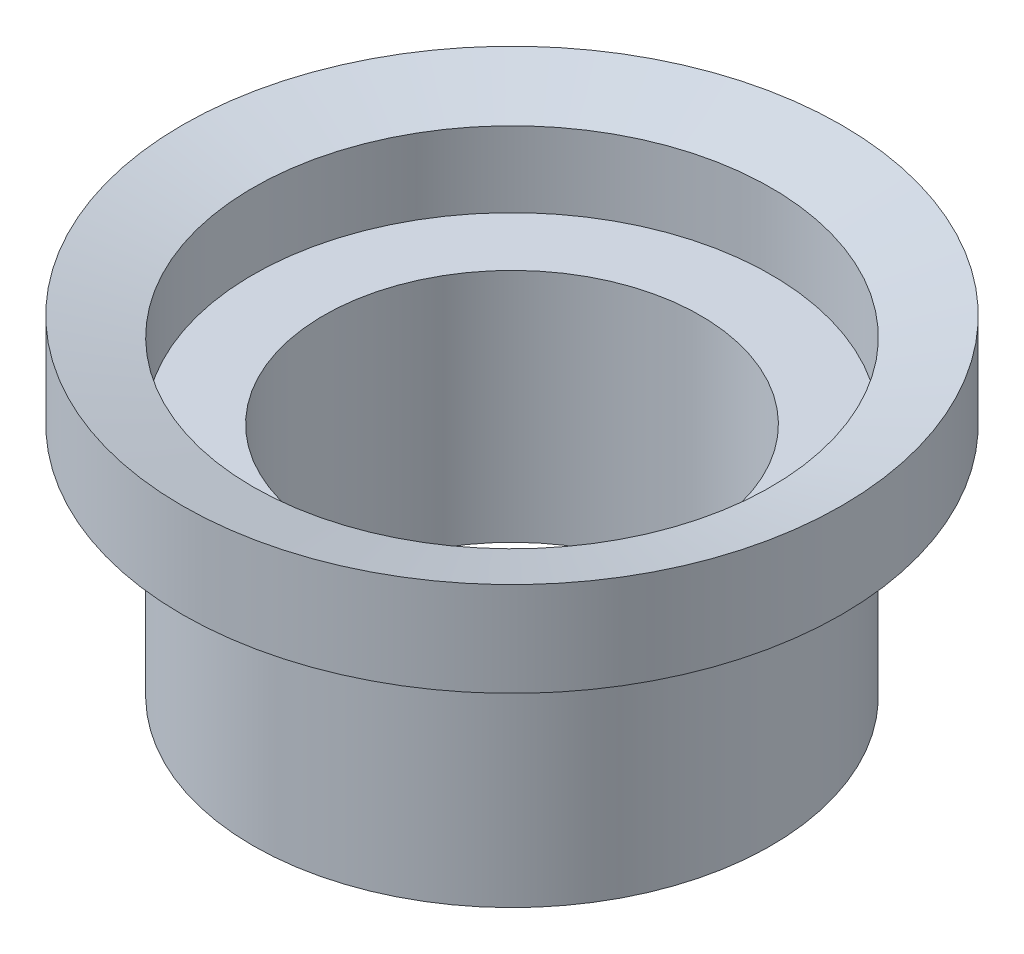
ISO-10303-21;
HEADER;
FILE_DESCRIPTION(('STEP AP214'),'2;1');
FILE_NAME('part.step','',(''),(''),'','','');
FILE_SCHEMA(('AUTOMOTIVE_DESIGN { 1 0 10303 214 1 1 1 1 }'));
ENDSEC;
DATA;
#1=APPLICATION_CONTEXT('core data for automotive mechanical design processes');
#2=APPLICATION_PROTOCOL_DEFINITION('international standard','automotive_design',2000,#1);
#3=PRODUCT_CONTEXT('',#1,'mechanical');
#4=PRODUCT('Part','Part','',(#3));
#5=PRODUCT_RELATED_PRODUCT_CATEGORY('part','',(#4));
#6=PRODUCT_DEFINITION_FORMATION('','',#4);
#7=PRODUCT_DEFINITION_CONTEXT('part definition',#1,'design');
#8=PRODUCT_DEFINITION('design','',#6,#7);
#9=PRODUCT_DEFINITION_SHAPE('','',#8);
#10=(LENGTH_UNIT() NAMED_UNIT(*) SI_UNIT(.MILLI.,.METRE.));
#11=(NAMED_UNIT(*) PLANE_ANGLE_UNIT() SI_UNIT($,.RADIAN.));
#12=(NAMED_UNIT(*) SI_UNIT($,.STERADIAN.) SOLID_ANGLE_UNIT());
#13=UNCERTAINTY_MEASURE_WITH_UNIT(LENGTH_MEASURE(1.E-05),#10,'distance_accuracy_value','');
#14=(GEOMETRIC_REPRESENTATION_CONTEXT(3) GLOBAL_UNCERTAINTY_ASSIGNED_CONTEXT((#13)) GLOBAL_UNIT_ASSIGNED_CONTEXT((#10,
#11,#12)) REPRESENTATION_CONTEXT('',''));
#15=CARTESIAN_POINT('',(0.,0.,0.));
#16=DIRECTION('',(0.,0.,1.));
#17=DIRECTION('',(1.,0.,0.));
#18=AXIS2_PLACEMENT_3D('',#15,#16,#17);
#19=CARTESIAN_POINT('',(0.,21.,0.));
#20=DIRECTION('',(0.,-1.,0.));
#21=DIRECTION('',(0.,0.,-1.));
#22=AXIS2_PLACEMENT_3D('',#19,#20,#21);
#23=CYLINDRICAL_SURFACE('',#22,16.5);
#24=CARTESIAN_POINT('',(0.,15.,0.));
#25=DIRECTION('',(0.,1.,0.));
#26=DIRECTION('',(0.,0.,1.));
#27=AXIS2_PLACEMENT_3D('',#24,#25,#26);
#28=CIRCLE('',#27,16.5);
#29=CARTESIAN_POINT('',(0.,15.,16.5));
#30=VERTEX_POINT('',#29);
#31=EDGE_CURVE('E47',#30,#30,#28,.T.);
#32=ORIENTED_EDGE('',*,*,#31,.F.);
#33=EDGE_LOOP('',(#32));
#34=FACE_BOUND('',#33,.T.);
#35=CARTESIAN_POINT('',(0.,19.79422863406,0.));
#36=DIRECTION('',(0.,1.,0.));
#37=DIRECTION('',(0.,0.,1.));
#38=AXIS2_PLACEMENT_3D('',#35,#36,#37);
#39=CIRCLE('',#38,16.5);
#40=CARTESIAN_POINT('',(0.,19.79422863406,16.5));
#41=VERTEX_POINT('',#40);
#42=EDGE_CURVE('E43',#41,#41,#39,.T.);
#43=ORIENTED_EDGE('',*,*,#42,.T.);
#44=EDGE_LOOP('',(#43));
#45=FACE_BOUND('',#44,.T.);
#46=ADVANCED_FACE('F39',(#34,#45),#23,.F.);
#47=CARTESIAN_POINT('',(0.,15.,0.));
#48=DIRECTION('',(0.,1.,0.));
#49=DIRECTION('',(0.,0.,1.));
#50=AXIS2_PLACEMENT_3D('',#47,#48,#49);
#51=PLANE('',#50);
#52=CARTESIAN_POINT('',(0.,15.,0.));
#53=DIRECTION('',(0.,1.,0.));
#54=DIRECTION('',(0.,0.,1.));
#55=AXIS2_PLACEMENT_3D('',#52,#53,#54);
#56=CIRCLE('',#55,21.);
#57=CARTESIAN_POINT('',(0.,15.,21.));
#58=VERTEX_POINT('',#57);
#59=EDGE_CURVE('E11',#58,#58,#56,.T.);
#60=ORIENTED_EDGE('',*,*,#59,.F.);
#61=EDGE_LOOP('',(#60));
#62=FACE_BOUND('',#61,.T.);
#63=ORIENTED_EDGE('',*,*,#31,.T.);
#64=EDGE_LOOP('',(#63));
#65=FACE_BOUND('',#64,.T.);
#66=ADVANCED_FACE('F68',(#62,#65),#51,.F.);
#67=CARTESIAN_POINT('',(0.,21.,0.));
#68=DIRECTION('',(0.,-1.,0.));
#69=DIRECTION('',(0.,0.,-1.));
#70=AXIS2_PLACEMENT_3D('',#67,#68,#69);
#71=CYLINDRICAL_SURFACE('',#70,21.);
#72=CARTESIAN_POINT('',(0.,21.,0.));
#73=DIRECTION('',(0.,-1.,0.));
#74=DIRECTION('',(0.,0.,-1.));
#75=AXIS2_PLACEMENT_3D('',#72,#73,#74);
#76=CIRCLE('',#75,21.);
#77=CARTESIAN_POINT('',(0.,21.,-21.));
#78=VERTEX_POINT('',#77);
#79=EDGE_CURVE('E53',#78,#78,#76,.T.);
#80=ORIENTED_EDGE('',*,*,#79,.T.);
#81=EDGE_LOOP('',(#80));
#82=FACE_BOUND('',#81,.T.);
#83=ORIENTED_EDGE('',*,*,#59,.T.);
#84=EDGE_LOOP('',(#83));
#85=FACE_BOUND('',#84,.T.);
#86=ADVANCED_FACE('F41',(#82,#85),#71,.T.);
#87=CARTESIAN_POINT('',(0.,21.,0.));
#88=DIRECTION('',(0.,1.,0.));
#89=DIRECTION('',(0.,0.,1.));
#90=AXIS2_PLACEMENT_3D('',#87,#88,#89);
#91=CONICAL_SURFACE('',#90,21.,1.30899693899575);
#92=ORIENTED_EDGE('',*,*,#42,.F.);
#93=EDGE_LOOP('',(#92));
#94=FACE_BOUND('',#93,.T.);
#95=ORIENTED_EDGE('',*,*,#79,.F.);
#96=EDGE_LOOP('',(#95));
#97=FACE_BOUND('',#96,.T.);
#98=ADVANCED_FACE('F61',(#94,#97),#91,.F.);
#99=CLOSED_SHELL('',(#46,#66,#86,#98));
#100=MANIFOLD_SOLID_BREP('B2',#99);
#101=CARTESIAN_POINT('',(0.,15.,0.));
#102=DIRECTION('',(0.,1.,0.));
#103=DIRECTION('',(0.,0.,1.));
#104=AXIS2_PLACEMENT_3D('',#101,#102,#103);
#105=PLANE('',#104);
#106=CARTESIAN_POINT('',(0.,15.,0.));
#107=DIRECTION('',(0.,1.,0.));
#108=DIRECTION('',(0.,0.,1.));
#109=AXIS2_PLACEMENT_3D('',#106,#107,#108);
#110=CIRCLE('',#109,16.5);
#111=CARTESIAN_POINT('',(0.,15.,16.5));
#112=VERTEX_POINT('',#111);
#113=EDGE_CURVE('E38',#112,#112,#110,.T.);
#114=ORIENTED_EDGE('',*,*,#113,.T.);
#115=EDGE_LOOP('',(#114));
#116=FACE_BOUND('',#115,.T.);
#117=CARTESIAN_POINT('',(0.,15.,0.));
#118=DIRECTION('',(0.,1.,0.));
#119=DIRECTION('',(0.,0.,1.));
#120=AXIS2_PLACEMENT_3D('',#117,#118,#119);
#121=CIRCLE('',#120,12.);
#122=CARTESIAN_POINT('',(0.,15.,12.));
#123=VERTEX_POINT('',#122);
#124=EDGE_CURVE('E112',#123,#123,#121,.T.);
#125=ORIENTED_EDGE('',*,*,#124,.F.);
#126=EDGE_LOOP('',(#125));
#127=FACE_BOUND('',#126,.T.);
#128=ADVANCED_FACE('F101',(#116,#127),#105,.T.);
#129=CARTESIAN_POINT('',(0.,0.,0.));
#130=DIRECTION('',(0.,1.,0.));
#131=DIRECTION('',(0.,0.,1.));
#132=AXIS2_PLACEMENT_3D('',#129,#130,#131);
#133=PLANE('',#132);
#134=CARTESIAN_POINT('',(0.,0.,0.));
#135=DIRECTION('',(0.,1.,0.));
#136=DIRECTION('',(0.,0.,1.));
#137=AXIS2_PLACEMENT_3D('',#134,#135,#136);
#138=CIRCLE('',#137,16.5);
#139=CARTESIAN_POINT('',(0.,0.,16.5));
#140=VERTEX_POINT('',#139);
#141=EDGE_CURVE('E105',#140,#140,#138,.T.);
#142=ORIENTED_EDGE('',*,*,#141,.F.);
#143=EDGE_LOOP('',(#142));
#144=FACE_BOUND('',#143,.T.);
#145=CARTESIAN_POINT('',(0.,0.,0.));
#146=DIRECTION('',(0.,1.,0.));
#147=DIRECTION('',(0.,0.,1.));
#148=AXIS2_PLACEMENT_3D('',#145,#146,#147);
#149=CIRCLE('',#148,12.);
#150=CARTESIAN_POINT('',(0.,0.,12.));
#151=VERTEX_POINT('',#150);
#152=EDGE_CURVE('E114',#151,#151,#149,.T.);
#153=ORIENTED_EDGE('',*,*,#152,.T.);
#154=EDGE_LOOP('',(#153));
#155=FACE_BOUND('',#154,.T.);
#156=ADVANCED_FACE('F124',(#144,#155),#133,.F.);
#157=CARTESIAN_POINT('',(0.,15.,0.));
#158=DIRECTION('',(0.,-1.,0.));
#159=DIRECTION('',(0.,0.,-1.));
#160=AXIS2_PLACEMENT_3D('',#157,#158,#159);
#161=CYLINDRICAL_SURFACE('',#160,16.5);
#162=ORIENTED_EDGE('',*,*,#113,.F.);
#163=EDGE_LOOP('',(#162));
#164=FACE_BOUND('',#163,.T.);
#165=ORIENTED_EDGE('',*,*,#141,.T.);
#166=EDGE_LOOP('',(#165));
#167=FACE_BOUND('',#166,.T.);
#168=ADVANCED_FACE('F103',(#164,#167),#161,.T.);
#169=CARTESIAN_POINT('',(0.,15.,0.));
#170=DIRECTION('',(0.,-1.,0.));
#171=DIRECTION('',(0.,0.,-1.));
#172=AXIS2_PLACEMENT_3D('',#169,#170,#171);
#173=CYLINDRICAL_SURFACE('',#172,12.);
#174=ORIENTED_EDGE('',*,*,#124,.T.);
#175=EDGE_LOOP('',(#174));
#176=FACE_BOUND('',#175,.T.);
#177=ORIENTED_EDGE('',*,*,#152,.F.);
#178=EDGE_LOOP('',(#177));
#179=FACE_BOUND('',#178,.T.);
#180=ADVANCED_FACE('F120',(#176,#179),#173,.F.);
#181=CLOSED_SHELL('',(#128,#156,#168,#180));
#182=MANIFOLD_SOLID_BREP('B6',#181);
#183=ADVANCED_BREP_SHAPE_REPRESENTATION('',(#18,#100,#182),#14);
#184=SHAPE_DEFINITION_REPRESENTATION(#9,#183);
ENDSEC;
END-ISO-10303-21;
